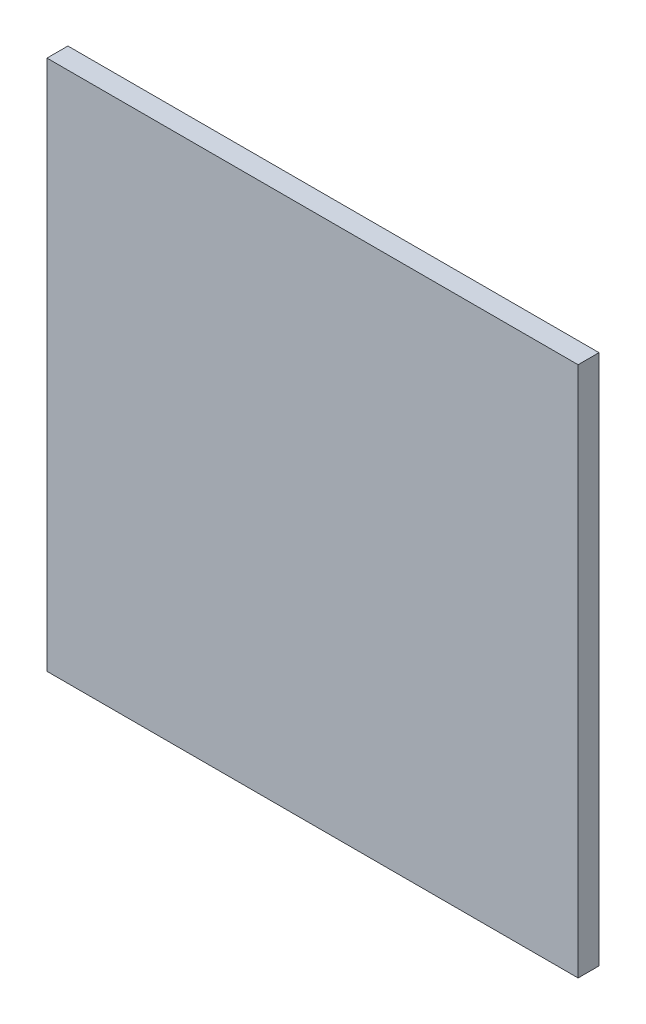
ISO-10303-21;
HEADER;
FILE_DESCRIPTION(('STEP AP214'),'2;1');
FILE_NAME('part.step','',(''),(''),'','','');
FILE_SCHEMA(('AUTOMOTIVE_DESIGN { 1 0 10303 214 1 1 1 1 }'));
ENDSEC;
DATA;
#1=APPLICATION_CONTEXT('core data for automotive mechanical design processes');
#2=APPLICATION_PROTOCOL_DEFINITION('international standard','automotive_design',2000,#1);
#3=PRODUCT_CONTEXT('',#1,'mechanical');
#4=PRODUCT('Part','Part','',(#3));
#5=PRODUCT_RELATED_PRODUCT_CATEGORY('part','',(#4));
#6=PRODUCT_DEFINITION_FORMATION('','',#4);
#7=PRODUCT_DEFINITION_CONTEXT('part definition',#1,'design');
#8=PRODUCT_DEFINITION('design','',#6,#7);
#9=PRODUCT_DEFINITION_SHAPE('','',#8);
#10=(LENGTH_UNIT() NAMED_UNIT(*) SI_UNIT(.MILLI.,.METRE.));
#11=(NAMED_UNIT(*) PLANE_ANGLE_UNIT() SI_UNIT($,.RADIAN.));
#12=(NAMED_UNIT(*) SI_UNIT($,.STERADIAN.) SOLID_ANGLE_UNIT());
#13=UNCERTAINTY_MEASURE_WITH_UNIT(LENGTH_MEASURE(1.E-05),#10,'distance_accuracy_value','');
#14=(GEOMETRIC_REPRESENTATION_CONTEXT(3) GLOBAL_UNCERTAINTY_ASSIGNED_CONTEXT((#13)) GLOBAL_UNIT_ASSIGNED_CONTEXT((#10,
#11,#12)) REPRESENTATION_CONTEXT('',''));
#15=CARTESIAN_POINT('',(0.,0.,0.));
#16=DIRECTION('',(0.,0.,1.));
#17=DIRECTION('',(1.,0.,0.));
#18=AXIS2_PLACEMENT_3D('',#15,#16,#17);
#19=CARTESIAN_POINT('',(38.1,-38.1,3.));
#20=DIRECTION('',(-1.,0.,0.));
#21=DIRECTION('',(0.,0.,1.));
#22=AXIS2_PLACEMENT_3D('',#19,#20,#21);
#23=PLANE('',#22);
#24=DIRECTION('',(0.,1.,0.));
#25=VECTOR('',#24,1.);
#26=CARTESIAN_POINT('',(38.1,-38.1,0.));
#27=LINE('',#26,#25);
#28=CARTESIAN_POINT('',(38.1,-38.1,0.));
#29=VERTEX_POINT('',#28);
#30=CARTESIAN_POINT('',(38.1,38.1,0.));
#31=VERTEX_POINT('',#30);
#32=EDGE_CURVE('E106',#29,#31,#27,.T.);
#33=ORIENTED_EDGE('',*,*,#32,.T.);
#34=DIRECTION('',(0.,0.,-1.));
#35=VECTOR('',#34,1.);
#36=CARTESIAN_POINT('',(38.1,38.1,3.));
#37=LINE('',#36,#35);
#38=CARTESIAN_POINT('',(38.1,38.1,3.));
#39=VERTEX_POINT('',#38);
#40=EDGE_CURVE('E11',#39,#31,#37,.T.);
#41=ORIENTED_EDGE('',*,*,#40,.F.);
#42=DIRECTION('',(0.,1.,0.));
#43=VECTOR('',#42,1.);
#44=CARTESIAN_POINT('',(38.1,-38.1,3.));
#45=LINE('',#44,#43);
#46=CARTESIAN_POINT('',(38.1,-38.1,3.));
#47=VERTEX_POINT('',#46);
#48=EDGE_CURVE('E94',#47,#39,#45,.T.);
#49=ORIENTED_EDGE('',*,*,#48,.F.);
#50=DIRECTION('',(0.,0.,-1.));
#51=VECTOR('',#50,1.);
#52=CARTESIAN_POINT('',(38.1,-38.1,3.));
#53=LINE('',#52,#51);
#54=EDGE_CURVE('E102',#47,#29,#53,.T.);
#55=ORIENTED_EDGE('',*,*,#54,.T.);
#56=EDGE_LOOP('',(#33,#41,#49,#55));
#57=FACE_BOUND('',#56,.T.);
#58=ADVANCED_FACE('F43',(#57),#23,.F.);
#59=CARTESIAN_POINT('',(-38.1,38.1,3.));
#60=DIRECTION('',(0.,-1.,0.));
#61=DIRECTION('',(0.,0.,-1.));
#62=AXIS2_PLACEMENT_3D('',#59,#60,#61);
#63=PLANE('',#62);
#64=DIRECTION('',(-1.,0.,0.));
#65=VECTOR('',#64,1.);
#66=CARTESIAN_POINT('',(-38.1,38.1,0.));
#67=LINE('',#66,#65);
#68=CARTESIAN_POINT('',(-38.1,38.1,0.));
#69=VERTEX_POINT('',#68);
#70=EDGE_CURVE('E98',#31,#69,#67,.T.);
#71=ORIENTED_EDGE('',*,*,#70,.T.);
#72=DIRECTION('',(0.,0.,-1.));
#73=VECTOR('',#72,1.);
#74=CARTESIAN_POINT('',(-38.1,38.1,3.));
#75=LINE('',#74,#73);
#76=CARTESIAN_POINT('',(-38.1,38.1,3.));
#77=VERTEX_POINT('',#76);
#78=EDGE_CURVE('E51',#77,#69,#75,.T.);
#79=ORIENTED_EDGE('',*,*,#78,.F.);
#80=DIRECTION('',(-1.,0.,0.));
#81=VECTOR('',#80,1.);
#82=CARTESIAN_POINT('',(-38.1,38.1,3.));
#83=LINE('',#82,#81);
#84=EDGE_CURVE('E89',#39,#77,#83,.T.);
#85=ORIENTED_EDGE('',*,*,#84,.F.);
#86=ORIENTED_EDGE('',*,*,#40,.T.);
#87=EDGE_LOOP('',(#71,#79,#85,#86));
#88=FACE_BOUND('',#87,.T.);
#89=ADVANCED_FACE('F97',(#88),#63,.F.);
#90=CARTESIAN_POINT('',(-38.1,-38.1,3.));
#91=DIRECTION('',(1.,0.,0.));
#92=DIRECTION('',(0.,0.,-1.));
#93=AXIS2_PLACEMENT_3D('',#90,#91,#92);
#94=PLANE('',#93);
#95=DIRECTION('',(0.,-1.,0.));
#96=VECTOR('',#95,1.);
#97=CARTESIAN_POINT('',(-38.1,-38.1,0.));
#98=LINE('',#97,#96);
#99=CARTESIAN_POINT('',(-38.1,-38.1,0.));
#100=VERTEX_POINT('',#99);
#101=EDGE_CURVE('E76',#69,#100,#98,.T.);
#102=ORIENTED_EDGE('',*,*,#101,.T.);
#103=DIRECTION('',(0.,0.,-1.));
#104=VECTOR('',#103,1.);
#105=CARTESIAN_POINT('',(-38.1,-38.1,3.));
#106=LINE('',#105,#104);
#107=CARTESIAN_POINT('',(-38.1,-38.1,3.));
#108=VERTEX_POINT('',#107);
#109=EDGE_CURVE('E99',#108,#100,#106,.T.);
#110=ORIENTED_EDGE('',*,*,#109,.F.);
#111=DIRECTION('',(0.,-1.,0.));
#112=VECTOR('',#111,1.);
#113=CARTESIAN_POINT('',(-38.1,-38.1,3.));
#114=LINE('',#113,#112);
#115=EDGE_CURVE('E92',#77,#108,#114,.T.);
#116=ORIENTED_EDGE('',*,*,#115,.F.);
#117=ORIENTED_EDGE('',*,*,#78,.T.);
#118=EDGE_LOOP('',(#102,#110,#116,#117));
#119=FACE_BOUND('',#118,.T.);
#120=ADVANCED_FACE('F100',(#119),#94,.F.);
#121=CARTESIAN_POINT('',(-38.1,-38.1,3.));
#122=DIRECTION('',(0.,1.,0.));
#123=DIRECTION('',(0.,0.,1.));
#124=AXIS2_PLACEMENT_3D('',#121,#122,#123);
#125=PLANE('',#124);
#126=DIRECTION('',(1.,0.,0.));
#127=VECTOR('',#126,1.);
#128=CARTESIAN_POINT('',(-38.1,-38.1,0.));
#129=LINE('',#128,#127);
#130=EDGE_CURVE('E82',#100,#29,#129,.T.);
#131=ORIENTED_EDGE('',*,*,#130,.T.);
#132=ORIENTED_EDGE('',*,*,#54,.F.);
#133=DIRECTION('',(1.,0.,0.));
#134=VECTOR('',#133,1.);
#135=CARTESIAN_POINT('',(-38.1,-38.1,3.));
#136=LINE('',#135,#134);
#137=EDGE_CURVE('E59',#108,#47,#136,.T.);
#138=ORIENTED_EDGE('',*,*,#137,.F.);
#139=ORIENTED_EDGE('',*,*,#109,.T.);
#140=EDGE_LOOP('',(#131,#132,#138,#139));
#141=FACE_BOUND('',#140,.T.);
#142=ADVANCED_FACE('F113',(#141),#125,.F.);
#143=CARTESIAN_POINT('',(0.,0.,3.));
#144=DIRECTION('',(0.,0.,-1.));
#145=DIRECTION('',(-1.,0.,0.));
#146=AXIS2_PLACEMENT_3D('',#143,#144,#145);
#147=PLANE('',#146);
#148=ORIENTED_EDGE('',*,*,#48,.T.);
#149=ORIENTED_EDGE('',*,*,#84,.T.);
#150=ORIENTED_EDGE('',*,*,#115,.T.);
#151=ORIENTED_EDGE('',*,*,#137,.T.);
#152=EDGE_LOOP('',(#148,#149,#150,#151));
#153=FACE_BOUND('',#152,.T.);
#154=ADVANCED_FACE('F90',(#153),#147,.F.);
#155=CARTESIAN_POINT('',(0.,0.,0.));
#156=DIRECTION('',(0.,0.,-1.));
#157=DIRECTION('',(-1.,0.,0.));
#158=AXIS2_PLACEMENT_3D('',#155,#156,#157);
#159=PLANE('',#158);
#160=ORIENTED_EDGE('',*,*,#32,.F.);
#161=ORIENTED_EDGE('',*,*,#130,.F.);
#162=ORIENTED_EDGE('',*,*,#101,.F.);
#163=ORIENTED_EDGE('',*,*,#70,.F.);
#164=EDGE_LOOP('',(#160,#161,#162,#163));
#165=FACE_BOUND('',#164,.T.);
#166=ADVANCED_FACE('F116',(#165),#159,.T.);
#167=CLOSED_SHELL('',(#58,#89,#120,#142,#154,#166));
#168=MANIFOLD_SOLID_BREP('B2',#167);
#169=ADVANCED_BREP_SHAPE_REPRESENTATION('',(#18,#168),#14);
#170=SHAPE_DEFINITION_REPRESENTATION(#9,#169);
ENDSEC;
END-ISO-10303-21;
